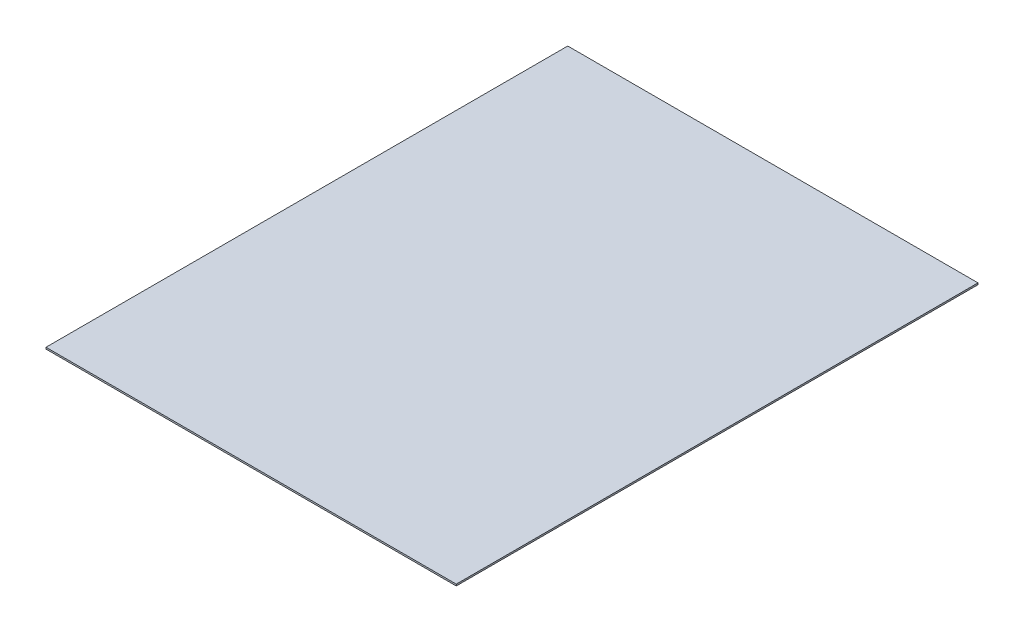
ISO-10303-21;
HEADER;
FILE_DESCRIPTION(('STEP AP214'),'2;1');
FILE_NAME('part.step','',(''),(''),'','','');
FILE_SCHEMA(('AUTOMOTIVE_DESIGN { 1 0 10303 214 1 1 1 1 }'));
ENDSEC;
DATA;
#1=APPLICATION_CONTEXT('core data for automotive mechanical design processes');
#2=APPLICATION_PROTOCOL_DEFINITION('international standard','automotive_design',2000,#1);
#3=PRODUCT_CONTEXT('',#1,'mechanical');
#4=PRODUCT('Part','Part','',(#3));
#5=PRODUCT_RELATED_PRODUCT_CATEGORY('part','',(#4));
#6=PRODUCT_DEFINITION_FORMATION('','',#4);
#7=PRODUCT_DEFINITION_CONTEXT('part definition',#1,'design');
#8=PRODUCT_DEFINITION('design','',#6,#7);
#9=PRODUCT_DEFINITION_SHAPE('','',#8);
#10=(LENGTH_UNIT() NAMED_UNIT(*) SI_UNIT(.MILLI.,.METRE.));
#11=(NAMED_UNIT(*) PLANE_ANGLE_UNIT() SI_UNIT($,.RADIAN.));
#12=(NAMED_UNIT(*) SI_UNIT($,.STERADIAN.) SOLID_ANGLE_UNIT());
#13=UNCERTAINTY_MEASURE_WITH_UNIT(LENGTH_MEASURE(1.E-05),#10,'distance_accuracy_value','');
#14=(GEOMETRIC_REPRESENTATION_CONTEXT(3) GLOBAL_UNCERTAINTY_ASSIGNED_CONTEXT((#13)) GLOBAL_UNIT_ASSIGNED_CONTEXT((#10,
#11,#12)) REPRESENTATION_CONTEXT('',''));
#15=CARTESIAN_POINT('',(0.,0.,0.));
#16=DIRECTION('',(0.,0.,1.));
#17=DIRECTION('',(1.,0.,0.));
#18=AXIS2_PLACEMENT_3D('',#15,#16,#17);
#19=CARTESIAN_POINT('',(-50.,2.,324.6498002723));
#20=DIRECTION('',(0.,0.,-1.));
#21=DIRECTION('',(-1.,0.,0.));
#22=AXIS2_PLACEMENT_3D('',#19,#20,#21);
#23=PLANE('',#22);
#24=DIRECTION('',(1.,0.,0.));
#25=VECTOR('',#24,1.);
#26=CARTESIAN_POINT('',(-50.,0.,324.6498002723));
#27=LINE('',#26,#25);
#28=CARTESIAN_POINT('',(-66.61,0.,324.6498002723));
#29=VERTEX_POINT('',#28);
#30=CARTESIAN_POINT('',(433.392150233643,0.,324.6498002723));
#31=VERTEX_POINT('',#30);
#32=EDGE_CURVE('E84',#29,#31,#27,.T.);
#33=ORIENTED_EDGE('',*,*,#32,.T.);
#34=DIRECTION('',(0.,-1.,0.));
#35=VECTOR('',#34,1.);
#36=CARTESIAN_POINT('',(433.392150233643,2.,324.6498002723));
#37=LINE('',#36,#35);
#38=CARTESIAN_POINT('',(433.392150233643,2.,324.6498002723));
#39=VERTEX_POINT('',#38);
#40=EDGE_CURVE('E11',#39,#31,#37,.T.);
#41=ORIENTED_EDGE('',*,*,#40,.F.);
#42=DIRECTION('',(1.,0.,0.));
#43=VECTOR('',#42,1.);
#44=CARTESIAN_POINT('',(-50.,2.,324.6498002723));
#45=LINE('',#44,#43);
#46=CARTESIAN_POINT('',(-66.61,2.,324.6498002723));
#47=VERTEX_POINT('',#46);
#48=EDGE_CURVE('E58',#47,#39,#45,.T.);
#49=ORIENTED_EDGE('',*,*,#48,.F.);
#50=DIRECTION('',(0.,-1.,0.));
#51=VECTOR('',#50,1.);
#52=CARTESIAN_POINT('',(-66.61,2.,324.6498002723));
#53=LINE('',#52,#51);
#54=EDGE_CURVE('E71',#47,#29,#53,.T.);
#55=ORIENTED_EDGE('',*,*,#54,.T.);
#56=EDGE_LOOP('',(#33,#41,#49,#55));
#57=FACE_BOUND('',#56,.T.);
#58=ADVANCED_FACE('F17',(#57),#23,.F.);
#59=CARTESIAN_POINT('',(433.392150233643,2.,50.));
#60=DIRECTION('',(-1.,0.,0.));
#61=DIRECTION('',(0.,0.,1.));
#62=AXIS2_PLACEMENT_3D('',#59,#60,#61);
#63=PLANE('',#62);
#64=DIRECTION('',(0.,0.,-1.));
#65=VECTOR('',#64,1.);
#66=CARTESIAN_POINT('',(433.392150233643,0.,50.));
#67=LINE('',#66,#65);
#68=CARTESIAN_POINT('',(433.392150233643,0.,-311.221822788352));
#69=VERTEX_POINT('',#68);
#70=EDGE_CURVE('E63',#31,#69,#67,.T.);
#71=ORIENTED_EDGE('',*,*,#70,.T.);
#72=DIRECTION('',(0.,-1.,0.));
#73=VECTOR('',#72,1.);
#74=CARTESIAN_POINT('',(433.392150233643,2.,-311.221822788352));
#75=LINE('',#74,#73);
#76=CARTESIAN_POINT('',(433.392150233643,2.,-311.221822788352));
#77=VERTEX_POINT('',#76);
#78=EDGE_CURVE('E21',#77,#69,#75,.T.);
#79=ORIENTED_EDGE('',*,*,#78,.F.);
#80=DIRECTION('',(0.,0.,-1.));
#81=VECTOR('',#80,1.);
#82=CARTESIAN_POINT('',(433.392150233643,2.,50.));
#83=LINE('',#82,#81);
#84=EDGE_CURVE('E51',#39,#77,#83,.T.);
#85=ORIENTED_EDGE('',*,*,#84,.F.);
#86=ORIENTED_EDGE('',*,*,#40,.T.);
#87=EDGE_LOOP('',(#71,#79,#85,#86));
#88=FACE_BOUND('',#87,.T.);
#89=ADVANCED_FACE('F19',(#88),#63,.F.);
#90=CARTESIAN_POINT('',(50.,2.,-311.221822788352));
#91=DIRECTION('',(0.,0.,1.));
#92=DIRECTION('',(1.,0.,0.));
#93=AXIS2_PLACEMENT_3D('',#90,#91,#92);
#94=PLANE('',#93);
#95=DIRECTION('',(-1.,0.,0.));
#96=VECTOR('',#95,1.);
#97=CARTESIAN_POINT('',(50.,0.,-311.221822788352));
#98=LINE('',#97,#96);
#99=CARTESIAN_POINT('',(-66.61,0.,-311.221822788352));
#100=VERTEX_POINT('',#99);
#101=EDGE_CURVE('E75',#69,#100,#98,.T.);
#102=ORIENTED_EDGE('',*,*,#101,.T.);
#103=DIRECTION('',(0.,-1.,0.));
#104=VECTOR('',#103,1.);
#105=CARTESIAN_POINT('',(-66.61,2.,-311.221822788352));
#106=LINE('',#105,#104);
#107=CARTESIAN_POINT('',(-66.61,2.,-311.221822788352));
#108=VERTEX_POINT('',#107);
#109=EDGE_CURVE('E67',#108,#100,#106,.T.);
#110=ORIENTED_EDGE('',*,*,#109,.F.);
#111=DIRECTION('',(-1.,0.,0.));
#112=VECTOR('',#111,1.);
#113=CARTESIAN_POINT('',(50.,2.,-311.221822788352));
#114=LINE('',#113,#112);
#115=EDGE_CURVE('E55',#77,#108,#114,.T.);
#116=ORIENTED_EDGE('',*,*,#115,.F.);
#117=ORIENTED_EDGE('',*,*,#78,.T.);
#118=EDGE_LOOP('',(#102,#110,#116,#117));
#119=FACE_BOUND('',#118,.T.);
#120=ADVANCED_FACE('F68',(#119),#94,.F.);
#121=CARTESIAN_POINT('',(-66.61,2.,-50.));
#122=DIRECTION('',(1.,0.,0.));
#123=DIRECTION('',(0.,0.,-1.));
#124=AXIS2_PLACEMENT_3D('',#121,#122,#123);
#125=PLANE('',#124);
#126=DIRECTION('',(0.,0.,1.));
#127=VECTOR('',#126,1.);
#128=CARTESIAN_POINT('',(-66.61,0.,-50.));
#129=LINE('',#128,#127);
#130=EDGE_CURVE('E77',#100,#29,#129,.T.);
#131=ORIENTED_EDGE('',*,*,#130,.T.);
#132=ORIENTED_EDGE('',*,*,#54,.F.);
#133=DIRECTION('',(0.,0.,1.));
#134=VECTOR('',#133,1.);
#135=CARTESIAN_POINT('',(-66.61,2.,-50.));
#136=LINE('',#135,#134);
#137=EDGE_CURVE('E35',#108,#47,#136,.T.);
#138=ORIENTED_EDGE('',*,*,#137,.F.);
#139=ORIENTED_EDGE('',*,*,#109,.T.);
#140=EDGE_LOOP('',(#131,#132,#138,#139));
#141=FACE_BOUND('',#140,.T.);
#142=ADVANCED_FACE('F98',(#141),#125,.F.);
#143=CARTESIAN_POINT('',(0.,2.,0.));
#144=DIRECTION('',(0.,1.,0.));
#145=DIRECTION('',(0.,0.,1.));
#146=AXIS2_PLACEMENT_3D('',#143,#144,#145);
#147=PLANE('',#146);
#148=ORIENTED_EDGE('',*,*,#48,.T.);
#149=ORIENTED_EDGE('',*,*,#84,.T.);
#150=ORIENTED_EDGE('',*,*,#115,.T.);
#151=ORIENTED_EDGE('',*,*,#137,.T.);
#152=EDGE_LOOP('',(#148,#149,#150,#151));
#153=FACE_BOUND('',#152,.T.);
#154=ADVANCED_FACE('F53',(#153),#147,.T.);
#155=CARTESIAN_POINT('',(0.,0.,0.));
#156=DIRECTION('',(0.,1.,0.));
#157=DIRECTION('',(0.,0.,1.));
#158=AXIS2_PLACEMENT_3D('',#155,#156,#157);
#159=PLANE('',#158);
#160=ORIENTED_EDGE('',*,*,#32,.F.);
#161=ORIENTED_EDGE('',*,*,#130,.F.);
#162=ORIENTED_EDGE('',*,*,#101,.F.);
#163=ORIENTED_EDGE('',*,*,#70,.F.);
#164=EDGE_LOOP('',(#160,#161,#162,#163));
#165=FACE_BOUND('',#164,.T.);
#166=ADVANCED_FACE('F96',(#165),#159,.F.);
#167=CLOSED_SHELL('',(#58,#89,#120,#142,#154,#166));
#168=MANIFOLD_SOLID_BREP('B1',#167);
#169=ADVANCED_BREP_SHAPE_REPRESENTATION('',(#18,#168),#14);
#170=SHAPE_DEFINITION_REPRESENTATION(#9,#169);
ENDSEC;
END-ISO-10303-21;
